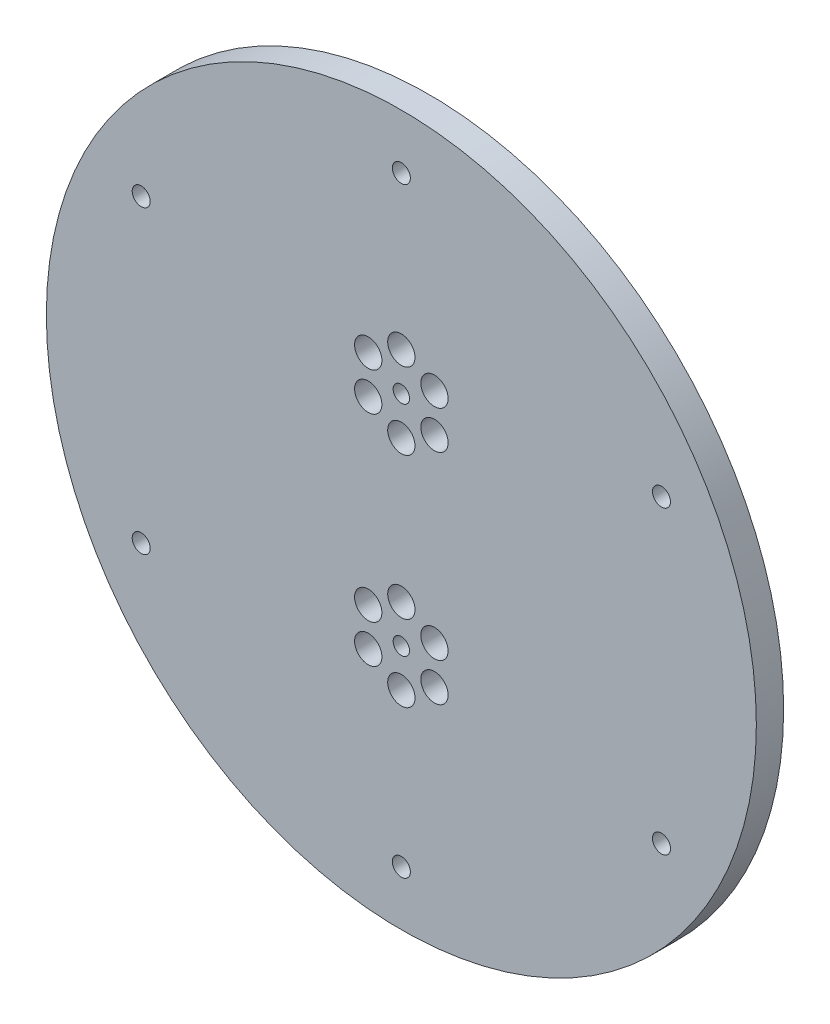
ISO-10303-21;
HEADER;
FILE_DESCRIPTION(('STEP AP214'),'2;1');
FILE_NAME('part.step','',(''),(''),'','','');
FILE_SCHEMA(('AUTOMOTIVE_DESIGN { 1 0 10303 214 1 1 1 1 }'));
ENDSEC;
DATA;
#1=APPLICATION_CONTEXT('core data for automotive mechanical design processes');
#2=APPLICATION_PROTOCOL_DEFINITION('international standard','automotive_design',2000,#1);
#3=PRODUCT_CONTEXT('',#1,'mechanical');
#4=PRODUCT('Part','Part','',(#3));
#5=PRODUCT_RELATED_PRODUCT_CATEGORY('part','',(#4));
#6=PRODUCT_DEFINITION_FORMATION('','',#4);
#7=PRODUCT_DEFINITION_CONTEXT('part definition',#1,'design');
#8=PRODUCT_DEFINITION('design','',#6,#7);
#9=PRODUCT_DEFINITION_SHAPE('','',#8);
#10=(LENGTH_UNIT() NAMED_UNIT(*) SI_UNIT(.MILLI.,.METRE.));
#11=(NAMED_UNIT(*) PLANE_ANGLE_UNIT() SI_UNIT($,.RADIAN.));
#12=(NAMED_UNIT(*) SI_UNIT($,.STERADIAN.) SOLID_ANGLE_UNIT());
#13=UNCERTAINTY_MEASURE_WITH_UNIT(LENGTH_MEASURE(1.E-05),#10,'distance_accuracy_value','');
#14=(GEOMETRIC_REPRESENTATION_CONTEXT(3) GLOBAL_UNCERTAINTY_ASSIGNED_CONTEXT((#13)) GLOBAL_UNIT_ASSIGNED_CONTEXT((#10,
#11,#12)) REPRESENTATION_CONTEXT('',''));
#15=CARTESIAN_POINT('',(0.,0.,0.));
#16=DIRECTION('',(0.,0.,1.));
#17=DIRECTION('',(1.,0.,0.));
#18=AXIS2_PLACEMENT_3D('',#15,#16,#17);
#19=CARTESIAN_POINT('',(0.,0.,5.));
#20=DIRECTION('',(0.,0.,1.));
#21=DIRECTION('',(1.,0.,0.));
#22=AXIS2_PLACEMENT_3D('',#19,#20,#21);
#23=PLANE('',#22);
#24=CARTESIAN_POINT('',(0.,-27.,5.));
#25=DIRECTION('',(0.,0.,1.));
#26=DIRECTION('',(-1.,0.,0.));
#27=AXIS2_PLACEMENT_3D('',#24,#25,#26);
#28=CIRCLE('',#27,2.5);
#29=CARTESIAN_POINT('',(-2.5,-27.,5.));
#30=VERTEX_POINT('',#29);
#31=EDGE_CURVE('E149',#30,#30,#28,.T.);
#32=ORIENTED_EDGE('',*,*,#31,.F.);
#33=EDGE_LOOP('',(#32));
#34=FACE_BOUND('',#33,.T.);
#35=CARTESIAN_POINT('',(0.,-20.,5.));
#36=DIRECTION('',(0.,0.,1.));
#37=DIRECTION('',(-1.,0.,0.));
#38=AXIS2_PLACEMENT_3D('',#35,#36,#37);
#39=CIRCLE('',#38,1.5);
#40=CARTESIAN_POINT('',(-1.5,-20.,5.));
#41=VERTEX_POINT('',#40);
#42=EDGE_CURVE('E137',#41,#41,#39,.T.);
#43=ORIENTED_EDGE('',*,*,#42,.F.);
#44=EDGE_LOOP('',(#43));
#45=FACE_BOUND('',#44,.T.);
#46=CARTESIAN_POINT('',(0.,-13.,5.));
#47=DIRECTION('',(0.,0.,1.));
#48=DIRECTION('',(-1.,0.,0.));
#49=AXIS2_PLACEMENT_3D('',#46,#47,#48);
#50=CIRCLE('',#49,2.5);
#51=CARTESIAN_POINT('',(-2.5,-13.,5.));
#52=VERTEX_POINT('',#51);
#53=EDGE_CURVE('E125',#52,#52,#50,.T.);
#54=ORIENTED_EDGE('',*,*,#53,.F.);
#55=EDGE_LOOP('',(#54));
#56=FACE_BOUND('',#55,.T.);
#57=CARTESIAN_POINT('',(-6.06217782649107,23.5,5.));
#58=DIRECTION('',(0.,0.,1.));
#59=DIRECTION('',(1.,0.,0.));
#60=AXIS2_PLACEMENT_3D('',#57,#58,#59);
#61=CIRCLE('',#60,2.5);
#62=CARTESIAN_POINT('',(-3.56217782649107,23.5,5.));
#63=VERTEX_POINT('',#62);
#64=EDGE_CURVE('E113',#63,#63,#61,.T.);
#65=ORIENTED_EDGE('',*,*,#64,.F.);
#66=EDGE_LOOP('',(#65));
#67=FACE_BOUND('',#66,.T.);
#68=CARTESIAN_POINT('',(0.,13.,5.));
#69=DIRECTION('',(0.,0.,1.));
#70=DIRECTION('',(1.,0.,0.));
#71=AXIS2_PLACEMENT_3D('',#68,#69,#70);
#72=CIRCLE('',#71,2.5);
#73=CARTESIAN_POINT('',(2.5,13.,5.));
#74=VERTEX_POINT('',#73);
#75=EDGE_CURVE('E101',#74,#74,#72,.T.);
#76=ORIENTED_EDGE('',*,*,#75,.F.);
#77=EDGE_LOOP('',(#76));
#78=FACE_BOUND('',#77,.T.);
#79=CARTESIAN_POINT('',(6.06217782649107,23.5,5.));
#80=DIRECTION('',(0.,0.,1.));
#81=DIRECTION('',(1.,0.,0.));
#82=AXIS2_PLACEMENT_3D('',#79,#80,#81);
#83=CIRCLE('',#82,2.5);
#84=CARTESIAN_POINT('',(8.56217782649107,23.5,5.));
#85=VERTEX_POINT('',#84);
#86=EDGE_CURVE('E89',#85,#85,#83,.T.);
#87=ORIENTED_EDGE('',*,*,#86,.F.);
#88=EDGE_LOOP('',(#87));
#89=FACE_BOUND('',#88,.T.);
#90=CARTESIAN_POINT('',(0.,27.,5.));
#91=DIRECTION('',(0.,0.,1.));
#92=DIRECTION('',(1.,0.,0.));
#93=AXIS2_PLACEMENT_3D('',#90,#91,#92);
#94=CIRCLE('',#93,2.5);
#95=CARTESIAN_POINT('',(2.50000000000001,27.,5.));
#96=VERTEX_POINT('',#95);
#97=EDGE_CURVE('E77',#96,#96,#94,.T.);
#98=ORIENTED_EDGE('',*,*,#97,.F.);
#99=EDGE_LOOP('',(#98));
#100=FACE_BOUND('',#99,.T.);
#101=CARTESIAN_POINT('',(-47.6313972081441,-27.5,5.));
#102=DIRECTION('',(0.,0.,1.));
#103=DIRECTION('',(1.,0.,0.));
#104=AXIS2_PLACEMENT_3D('',#101,#102,#103);
#105=CIRCLE('',#104,1.65);
#106=CARTESIAN_POINT('',(-45.9813972081441,-27.5,5.));
#107=VERTEX_POINT('',#106);
#108=EDGE_CURVE('E65',#107,#107,#105,.T.);
#109=ORIENTED_EDGE('',*,*,#108,.F.);
#110=EDGE_LOOP('',(#109));
#111=FACE_BOUND('',#110,.T.);
#112=CARTESIAN_POINT('',(47.6313972081441,-27.5,5.));
#113=DIRECTION('',(0.,0.,1.));
#114=DIRECTION('',(1.,0.,0.));
#115=AXIS2_PLACEMENT_3D('',#112,#113,#114);
#116=CIRCLE('',#115,1.65000000000015);
#117=CARTESIAN_POINT('',(49.2813972081443,-27.5,5.));
#118=VERTEX_POINT('',#117);
#119=EDGE_CURVE('E53',#118,#118,#116,.T.);
#120=ORIENTED_EDGE('',*,*,#119,.F.);
#121=EDGE_LOOP('',(#120));
#122=FACE_BOUND('',#121,.T.);
#123=CARTESIAN_POINT('',(0.,55.,5.));
#124=DIRECTION('',(0.,0.,1.));
#125=DIRECTION('',(1.,0.,0.));
#126=AXIS2_PLACEMENT_3D('',#123,#124,#125);
#127=CIRCLE('',#126,1.65);
#128=CARTESIAN_POINT('',(1.65,55.,5.));
#129=VERTEX_POINT('',#128);
#130=EDGE_CURVE('E42',#129,#129,#127,.T.);
#131=ORIENTED_EDGE('',*,*,#130,.F.);
#132=EDGE_LOOP('',(#131));
#133=FACE_BOUND('',#132,.T.);
#134=CARTESIAN_POINT('',(0.,0.,5.));
#135=DIRECTION('',(0.,0.,1.));
#136=DIRECTION('',(1.,0.,0.));
#137=AXIS2_PLACEMENT_3D('',#134,#135,#136);
#138=CIRCLE('',#137,65.);
#139=CARTESIAN_POINT('',(65.,0.,5.));
#140=VERTEX_POINT('',#139);
#141=EDGE_CURVE('E10',#140,#140,#138,.T.);
#142=ORIENTED_EDGE('',*,*,#141,.T.);
#143=EDGE_LOOP('',(#142));
#144=FACE_BOUND('',#143,.T.);
#145=CARTESIAN_POINT('',(47.6313972081441,27.5,5.));
#146=DIRECTION('',(0.,0.,1.));
#147=DIRECTION('',(1.,0.,0.));
#148=AXIS2_PLACEMENT_3D('',#145,#146,#147);
#149=CIRCLE('',#148,1.65000000000008);
#150=CARTESIAN_POINT('',(49.2813972081442,27.5,5.));
#151=VERTEX_POINT('',#150);
#152=EDGE_CURVE('E47',#151,#151,#149,.T.);
#153=ORIENTED_EDGE('',*,*,#152,.F.);
#154=EDGE_LOOP('',(#153));
#155=FACE_BOUND('',#154,.T.);
#156=CARTESIAN_POINT('',(0.,-55.,5.));
#157=DIRECTION('',(0.,0.,1.));
#158=DIRECTION('',(1.,0.,0.));
#159=AXIS2_PLACEMENT_3D('',#156,#157,#158);
#160=CIRCLE('',#159,1.65);
#161=CARTESIAN_POINT('',(1.65000000000001,-55.,5.));
#162=VERTEX_POINT('',#161);
#163=EDGE_CURVE('E59',#162,#162,#160,.T.);
#164=ORIENTED_EDGE('',*,*,#163,.F.);
#165=EDGE_LOOP('',(#164));
#166=FACE_BOUND('',#165,.T.);
#167=CARTESIAN_POINT('',(-47.6313972081442,27.5,5.));
#168=DIRECTION('',(0.,0.,1.));
#169=DIRECTION('',(1.,0.,0.));
#170=AXIS2_PLACEMENT_3D('',#167,#168,#169);
#171=CIRCLE('',#170,1.65);
#172=CARTESIAN_POINT('',(-45.9813972081442,27.5,5.));
#173=VERTEX_POINT('',#172);
#174=EDGE_CURVE('E71',#173,#173,#171,.T.);
#175=ORIENTED_EDGE('',*,*,#174,.F.);
#176=EDGE_LOOP('',(#175));
#177=FACE_BOUND('',#176,.T.);
#178=CARTESIAN_POINT('',(0.,20.,5.));
#179=DIRECTION('',(0.,0.,1.));
#180=DIRECTION('',(1.,0.,0.));
#181=AXIS2_PLACEMENT_3D('',#178,#179,#180);
#182=CIRCLE('',#181,1.5);
#183=CARTESIAN_POINT('',(1.5,20.,5.));
#184=VERTEX_POINT('',#183);
#185=EDGE_CURVE('E83',#184,#184,#182,.T.);
#186=ORIENTED_EDGE('',*,*,#185,.F.);
#187=EDGE_LOOP('',(#186));
#188=FACE_BOUND('',#187,.T.);
#189=CARTESIAN_POINT('',(6.06217782649107,16.5,5.));
#190=DIRECTION('',(0.,0.,1.));
#191=DIRECTION('',(1.,0.,0.));
#192=AXIS2_PLACEMENT_3D('',#189,#190,#191);
#193=CIRCLE('',#192,2.5);
#194=CARTESIAN_POINT('',(8.56217782649107,16.5,5.));
#195=VERTEX_POINT('',#194);
#196=EDGE_CURVE('E95',#195,#195,#193,.T.);
#197=ORIENTED_EDGE('',*,*,#196,.F.);
#198=EDGE_LOOP('',(#197));
#199=FACE_BOUND('',#198,.T.);
#200=CARTESIAN_POINT('',(-6.06217782649107,16.5,5.));
#201=DIRECTION('',(0.,0.,1.));
#202=DIRECTION('',(1.,0.,0.));
#203=AXIS2_PLACEMENT_3D('',#200,#201,#202);
#204=CIRCLE('',#203,2.5);
#205=CARTESIAN_POINT('',(-3.56217782649107,16.5,5.));
#206=VERTEX_POINT('',#205);
#207=EDGE_CURVE('E107',#206,#206,#204,.T.);
#208=ORIENTED_EDGE('',*,*,#207,.F.);
#209=EDGE_LOOP('',(#208));
#210=FACE_BOUND('',#209,.T.);
#211=CARTESIAN_POINT('',(6.06217782649107,-16.5,5.));
#212=DIRECTION('',(0.,0.,1.));
#213=DIRECTION('',(-1.,0.,0.));
#214=AXIS2_PLACEMENT_3D('',#211,#212,#213);
#215=CIRCLE('',#214,2.5);
#216=CARTESIAN_POINT('',(3.56217782649107,-16.5,5.));
#217=VERTEX_POINT('',#216);
#218=EDGE_CURVE('E119',#217,#217,#215,.T.);
#219=ORIENTED_EDGE('',*,*,#218,.F.);
#220=EDGE_LOOP('',(#219));
#221=FACE_BOUND('',#220,.T.);
#222=CARTESIAN_POINT('',(-6.06217782649107,-16.5,5.));
#223=DIRECTION('',(0.,0.,1.));
#224=DIRECTION('',(-1.,0.,0.));
#225=AXIS2_PLACEMENT_3D('',#222,#223,#224);
#226=CIRCLE('',#225,2.5);
#227=CARTESIAN_POINT('',(-8.56217782649107,-16.5,5.));
#228=VERTEX_POINT('',#227);
#229=EDGE_CURVE('E131',#228,#228,#226,.T.);
#230=ORIENTED_EDGE('',*,*,#229,.F.);
#231=EDGE_LOOP('',(#230));
#232=FACE_BOUND('',#231,.T.);
#233=CARTESIAN_POINT('',(-6.06217782649107,-23.5,5.));
#234=DIRECTION('',(0.,0.,1.));
#235=DIRECTION('',(-1.,0.,0.));
#236=AXIS2_PLACEMENT_3D('',#233,#234,#235);
#237=CIRCLE('',#236,2.5);
#238=CARTESIAN_POINT('',(-8.56217782649107,-23.5,5.));
#239=VERTEX_POINT('',#238);
#240=EDGE_CURVE('E143',#239,#239,#237,.T.);
#241=ORIENTED_EDGE('',*,*,#240,.F.);
#242=EDGE_LOOP('',(#241));
#243=FACE_BOUND('',#242,.T.);
#244=CARTESIAN_POINT('',(6.06217782649107,-23.5,5.));
#245=DIRECTION('',(0.,0.,1.));
#246=DIRECTION('',(-1.,0.,0.));
#247=AXIS2_PLACEMENT_3D('',#244,#245,#246);
#248=CIRCLE('',#247,2.5);
#249=CARTESIAN_POINT('',(3.56217782649107,-23.5,5.));
#250=VERTEX_POINT('',#249);
#251=EDGE_CURVE('E155',#250,#250,#248,.T.);
#252=ORIENTED_EDGE('',*,*,#251,.F.);
#253=EDGE_LOOP('',(#252));
#254=FACE_BOUND('',#253,.T.);
#255=ADVANCED_FACE('F31',(#34,#45,#56,#67,#78,#89,#100,#111,#122,#133,#144,#155,#166,#177,#188,
#199,#210,#221,#232,#243,#254),#23,.T.);
#256=CARTESIAN_POINT('',(0.,0.,0.));
#257=DIRECTION('',(0.,0.,1.));
#258=DIRECTION('',(1.,0.,0.));
#259=AXIS2_PLACEMENT_3D('',#256,#257,#258);
#260=PLANE('',#259);
#261=CARTESIAN_POINT('',(0.,0.,0.));
#262=DIRECTION('',(0.,0.,1.));
#263=DIRECTION('',(1.,0.,0.));
#264=AXIS2_PLACEMENT_3D('',#261,#262,#263);
#265=CIRCLE('',#264,65.);
#266=CARTESIAN_POINT('',(65.,0.,0.));
#267=VERTEX_POINT('',#266);
#268=EDGE_CURVE('E35',#267,#267,#265,.T.);
#269=ORIENTED_EDGE('',*,*,#268,.F.);
#270=EDGE_LOOP('',(#269));
#271=FACE_BOUND('',#270,.T.);
#272=CARTESIAN_POINT('',(0.,55.,0.));
#273=DIRECTION('',(0.,0.,1.));
#274=DIRECTION('',(1.,0.,0.));
#275=AXIS2_PLACEMENT_3D('',#272,#273,#274);
#276=CIRCLE('',#275,1.65);
#277=CARTESIAN_POINT('',(1.65,55.,0.));
#278=VERTEX_POINT('',#277);
#279=EDGE_CURVE('E44',#278,#278,#276,.T.);
#280=ORIENTED_EDGE('',*,*,#279,.T.);
#281=EDGE_LOOP('',(#280));
#282=FACE_BOUND('',#281,.T.);
#283=CARTESIAN_POINT('',(47.6313972081441,27.5,0.));
#284=DIRECTION('',(0.,0.,1.));
#285=DIRECTION('',(1.,0.,0.));
#286=AXIS2_PLACEMENT_3D('',#283,#284,#285);
#287=CIRCLE('',#286,1.65000000000008);
#288=CARTESIAN_POINT('',(49.2813972081442,27.5,0.));
#289=VERTEX_POINT('',#288);
#290=EDGE_CURVE('E50',#289,#289,#287,.T.);
#291=ORIENTED_EDGE('',*,*,#290,.T.);
#292=EDGE_LOOP('',(#291));
#293=FACE_BOUND('',#292,.T.);
#294=CARTESIAN_POINT('',(47.6313972081441,-27.5,0.));
#295=DIRECTION('',(0.,0.,1.));
#296=DIRECTION('',(1.,0.,0.));
#297=AXIS2_PLACEMENT_3D('',#294,#295,#296);
#298=CIRCLE('',#297,1.65000000000015);
#299=CARTESIAN_POINT('',(49.2813972081443,-27.5,0.));
#300=VERTEX_POINT('',#299);
#301=EDGE_CURVE('E56',#300,#300,#298,.T.);
#302=ORIENTED_EDGE('',*,*,#301,.T.);
#303=EDGE_LOOP('',(#302));
#304=FACE_BOUND('',#303,.T.);
#305=CARTESIAN_POINT('',(0.,-55.,0.));
#306=DIRECTION('',(0.,0.,1.));
#307=DIRECTION('',(1.,0.,0.));
#308=AXIS2_PLACEMENT_3D('',#305,#306,#307);
#309=CIRCLE('',#308,1.65);
#310=CARTESIAN_POINT('',(1.65000000000001,-55.,0.));
#311=VERTEX_POINT('',#310);
#312=EDGE_CURVE('E62',#311,#311,#309,.T.);
#313=ORIENTED_EDGE('',*,*,#312,.T.);
#314=EDGE_LOOP('',(#313));
#315=FACE_BOUND('',#314,.T.);
#316=CARTESIAN_POINT('',(-47.6313972081441,-27.5,0.));
#317=DIRECTION('',(0.,0.,1.));
#318=DIRECTION('',(1.,0.,0.));
#319=AXIS2_PLACEMENT_3D('',#316,#317,#318);
#320=CIRCLE('',#319,1.65);
#321=CARTESIAN_POINT('',(-45.9813972081441,-27.5,0.));
#322=VERTEX_POINT('',#321);
#323=EDGE_CURVE('E68',#322,#322,#320,.T.);
#324=ORIENTED_EDGE('',*,*,#323,.T.);
#325=EDGE_LOOP('',(#324));
#326=FACE_BOUND('',#325,.T.);
#327=CARTESIAN_POINT('',(-47.6313972081442,27.5,0.));
#328=DIRECTION('',(0.,0.,1.));
#329=DIRECTION('',(1.,0.,0.));
#330=AXIS2_PLACEMENT_3D('',#327,#328,#329);
#331=CIRCLE('',#330,1.65);
#332=CARTESIAN_POINT('',(-45.9813972081442,27.5,0.));
#333=VERTEX_POINT('',#332);
#334=EDGE_CURVE('E74',#333,#333,#331,.T.);
#335=ORIENTED_EDGE('',*,*,#334,.T.);
#336=EDGE_LOOP('',(#335));
#337=FACE_BOUND('',#336,.T.);
#338=CARTESIAN_POINT('',(0.,27.,0.));
#339=DIRECTION('',(0.,0.,1.));
#340=DIRECTION('',(1.,0.,0.));
#341=AXIS2_PLACEMENT_3D('',#338,#339,#340);
#342=CIRCLE('',#341,2.5);
#343=CARTESIAN_POINT('',(2.50000000000001,27.,0.));
#344=VERTEX_POINT('',#343);
#345=EDGE_CURVE('E80',#344,#344,#342,.T.);
#346=ORIENTED_EDGE('',*,*,#345,.T.);
#347=EDGE_LOOP('',(#346));
#348=FACE_BOUND('',#347,.T.);
#349=CARTESIAN_POINT('',(0.,20.,0.));
#350=DIRECTION('',(0.,0.,1.));
#351=DIRECTION('',(1.,0.,0.));
#352=AXIS2_PLACEMENT_3D('',#349,#350,#351);
#353=CIRCLE('',#352,1.5);
#354=CARTESIAN_POINT('',(1.5,20.,0.));
#355=VERTEX_POINT('',#354);
#356=EDGE_CURVE('E86',#355,#355,#353,.T.);
#357=ORIENTED_EDGE('',*,*,#356,.T.);
#358=EDGE_LOOP('',(#357));
#359=FACE_BOUND('',#358,.T.);
#360=CARTESIAN_POINT('',(6.06217782649107,23.5,0.));
#361=DIRECTION('',(0.,0.,1.));
#362=DIRECTION('',(1.,0.,0.));
#363=AXIS2_PLACEMENT_3D('',#360,#361,#362);
#364=CIRCLE('',#363,2.5);
#365=CARTESIAN_POINT('',(8.56217782649107,23.5,0.));
#366=VERTEX_POINT('',#365);
#367=EDGE_CURVE('E92',#366,#366,#364,.T.);
#368=ORIENTED_EDGE('',*,*,#367,.T.);
#369=EDGE_LOOP('',(#368));
#370=FACE_BOUND('',#369,.T.);
#371=CARTESIAN_POINT('',(6.06217782649107,16.5,0.));
#372=DIRECTION('',(0.,0.,1.));
#373=DIRECTION('',(1.,0.,0.));
#374=AXIS2_PLACEMENT_3D('',#371,#372,#373);
#375=CIRCLE('',#374,2.5);
#376=CARTESIAN_POINT('',(8.56217782649107,16.5,0.));
#377=VERTEX_POINT('',#376);
#378=EDGE_CURVE('E98',#377,#377,#375,.T.);
#379=ORIENTED_EDGE('',*,*,#378,.T.);
#380=EDGE_LOOP('',(#379));
#381=FACE_BOUND('',#380,.T.);
#382=CARTESIAN_POINT('',(0.,13.,0.));
#383=DIRECTION('',(0.,0.,1.));
#384=DIRECTION('',(1.,0.,0.));
#385=AXIS2_PLACEMENT_3D('',#382,#383,#384);
#386=CIRCLE('',#385,2.5);
#387=CARTESIAN_POINT('',(2.5,13.,0.));
#388=VERTEX_POINT('',#387);
#389=EDGE_CURVE('E104',#388,#388,#386,.T.);
#390=ORIENTED_EDGE('',*,*,#389,.T.);
#391=EDGE_LOOP('',(#390));
#392=FACE_BOUND('',#391,.T.);
#393=CARTESIAN_POINT('',(-6.06217782649107,16.5,0.));
#394=DIRECTION('',(0.,0.,1.));
#395=DIRECTION('',(1.,0.,0.));
#396=AXIS2_PLACEMENT_3D('',#393,#394,#395);
#397=CIRCLE('',#396,2.5);
#398=CARTESIAN_POINT('',(-3.56217782649107,16.5,0.));
#399=VERTEX_POINT('',#398);
#400=EDGE_CURVE('E110',#399,#399,#397,.T.);
#401=ORIENTED_EDGE('',*,*,#400,.T.);
#402=EDGE_LOOP('',(#401));
#403=FACE_BOUND('',#402,.T.);
#404=CARTESIAN_POINT('',(-6.06217782649107,23.5,0.));
#405=DIRECTION('',(0.,0.,1.));
#406=DIRECTION('',(1.,0.,0.));
#407=AXIS2_PLACEMENT_3D('',#404,#405,#406);
#408=CIRCLE('',#407,2.5);
#409=CARTESIAN_POINT('',(-3.56217782649107,23.5,0.));
#410=VERTEX_POINT('',#409);
#411=EDGE_CURVE('E116',#410,#410,#408,.T.);
#412=ORIENTED_EDGE('',*,*,#411,.T.);
#413=EDGE_LOOP('',(#412));
#414=FACE_BOUND('',#413,.T.);
#415=CARTESIAN_POINT('',(6.06217782649107,-16.5,0.));
#416=DIRECTION('',(0.,0.,1.));
#417=DIRECTION('',(-1.,0.,0.));
#418=AXIS2_PLACEMENT_3D('',#415,#416,#417);
#419=CIRCLE('',#418,2.5);
#420=CARTESIAN_POINT('',(3.56217782649107,-16.5,0.));
#421=VERTEX_POINT('',#420);
#422=EDGE_CURVE('E122',#421,#421,#419,.T.);
#423=ORIENTED_EDGE('',*,*,#422,.T.);
#424=EDGE_LOOP('',(#423));
#425=FACE_BOUND('',#424,.T.);
#426=CARTESIAN_POINT('',(0.,-13.,0.));
#427=DIRECTION('',(0.,0.,1.));
#428=DIRECTION('',(-1.,0.,0.));
#429=AXIS2_PLACEMENT_3D('',#426,#427,#428);
#430=CIRCLE('',#429,2.5);
#431=CARTESIAN_POINT('',(-2.5,-13.,0.));
#432=VERTEX_POINT('',#431);
#433=EDGE_CURVE('E128',#432,#432,#430,.T.);
#434=ORIENTED_EDGE('',*,*,#433,.T.);
#435=EDGE_LOOP('',(#434));
#436=FACE_BOUND('',#435,.T.);
#437=CARTESIAN_POINT('',(-6.06217782649107,-16.5,0.));
#438=DIRECTION('',(0.,0.,1.));
#439=DIRECTION('',(-1.,0.,0.));
#440=AXIS2_PLACEMENT_3D('',#437,#438,#439);
#441=CIRCLE('',#440,2.5);
#442=CARTESIAN_POINT('',(-8.56217782649107,-16.5,0.));
#443=VERTEX_POINT('',#442);
#444=EDGE_CURVE('E134',#443,#443,#441,.T.);
#445=ORIENTED_EDGE('',*,*,#444,.T.);
#446=EDGE_LOOP('',(#445));
#447=FACE_BOUND('',#446,.T.);
#448=CARTESIAN_POINT('',(0.,-20.,0.));
#449=DIRECTION('',(0.,0.,1.));
#450=DIRECTION('',(-1.,0.,0.));
#451=AXIS2_PLACEMENT_3D('',#448,#449,#450);
#452=CIRCLE('',#451,1.5);
#453=CARTESIAN_POINT('',(-1.5,-20.,0.));
#454=VERTEX_POINT('',#453);
#455=EDGE_CURVE('E140',#454,#454,#452,.T.);
#456=ORIENTED_EDGE('',*,*,#455,.T.);
#457=EDGE_LOOP('',(#456));
#458=FACE_BOUND('',#457,.T.);
#459=CARTESIAN_POINT('',(-6.06217782649107,-23.5,0.));
#460=DIRECTION('',(0.,0.,1.));
#461=DIRECTION('',(-1.,0.,0.));
#462=AXIS2_PLACEMENT_3D('',#459,#460,#461);
#463=CIRCLE('',#462,2.5);
#464=CARTESIAN_POINT('',(-8.56217782649107,-23.5,0.));
#465=VERTEX_POINT('',#464);
#466=EDGE_CURVE('E146',#465,#465,#463,.T.);
#467=ORIENTED_EDGE('',*,*,#466,.T.);
#468=EDGE_LOOP('',(#467));
#469=FACE_BOUND('',#468,.T.);
#470=CARTESIAN_POINT('',(0.,-27.,0.));
#471=DIRECTION('',(0.,0.,1.));
#472=DIRECTION('',(-1.,0.,0.));
#473=AXIS2_PLACEMENT_3D('',#470,#471,#472);
#474=CIRCLE('',#473,2.5);
#475=CARTESIAN_POINT('',(-2.5,-27.,0.));
#476=VERTEX_POINT('',#475);
#477=EDGE_CURVE('E152',#476,#476,#474,.T.);
#478=ORIENTED_EDGE('',*,*,#477,.T.);
#479=EDGE_LOOP('',(#478));
#480=FACE_BOUND('',#479,.T.);
#481=CARTESIAN_POINT('',(6.06217782649107,-23.5,0.));
#482=DIRECTION('',(0.,0.,1.));
#483=DIRECTION('',(-1.,0.,0.));
#484=AXIS2_PLACEMENT_3D('',#481,#482,#483);
#485=CIRCLE('',#484,2.5);
#486=CARTESIAN_POINT('',(3.56217782649107,-23.5,0.));
#487=VERTEX_POINT('',#486);
#488=EDGE_CURVE('E158',#487,#487,#485,.T.);
#489=ORIENTED_EDGE('',*,*,#488,.T.);
#490=EDGE_LOOP('',(#489));
#491=FACE_BOUND('',#490,.T.);
#492=ADVANCED_FACE('F168',(#271,#282,#293,#304,#315,#326,#337,#348,#359,#370,#381,#392,#403,
#414,#425,#436,#447,#458,#469,#480,#491),#260,.F.);
#493=CARTESIAN_POINT('',(0.,0.,5.));
#494=DIRECTION('',(0.,0.,-1.));
#495=DIRECTION('',(-1.,0.,0.));
#496=AXIS2_PLACEMENT_3D('',#493,#494,#495);
#497=CYLINDRICAL_SURFACE('',#496,65.);
#498=ORIENTED_EDGE('',*,*,#141,.F.);
#499=EDGE_LOOP('',(#498));
#500=FACE_BOUND('',#499,.T.);
#501=ORIENTED_EDGE('',*,*,#268,.T.);
#502=EDGE_LOOP('',(#501));
#503=FACE_BOUND('',#502,.T.);
#504=ADVANCED_FACE('F33',(#500,#503),#497,.T.);
#505=CARTESIAN_POINT('',(0.,55.,5.));
#506=DIRECTION('',(0.,0.,-1.));
#507=DIRECTION('',(-1.,0.,0.));
#508=AXIS2_PLACEMENT_3D('',#505,#506,#507);
#509=CYLINDRICAL_SURFACE('',#508,1.65);
#510=ORIENTED_EDGE('',*,*,#130,.T.);
#511=EDGE_LOOP('',(#510));
#512=FACE_BOUND('',#511,.T.);
#513=ORIENTED_EDGE('',*,*,#279,.F.);
#514=EDGE_LOOP('',(#513));
#515=FACE_BOUND('',#514,.T.);
#516=ADVANCED_FACE('F178',(#512,#515),#509,.F.);
#517=CARTESIAN_POINT('',(47.6313972081441,27.5,5.));
#518=DIRECTION('',(0.,0.,-1.));
#519=DIRECTION('',(-1.,0.,0.));
#520=AXIS2_PLACEMENT_3D('',#517,#518,#519);
#521=CYLINDRICAL_SURFACE('',#520,1.65000000000008);
#522=ORIENTED_EDGE('',*,*,#152,.T.);
#523=EDGE_LOOP('',(#522));
#524=FACE_BOUND('',#523,.T.);
#525=ORIENTED_EDGE('',*,*,#290,.F.);
#526=EDGE_LOOP('',(#525));
#527=FACE_BOUND('',#526,.T.);
#528=ADVANCED_FACE('F181',(#524,#527),#521,.F.);
#529=CARTESIAN_POINT('',(47.6313972081441,-27.5,5.));
#530=DIRECTION('',(0.,0.,-1.));
#531=DIRECTION('',(-1.,0.,0.));
#532=AXIS2_PLACEMENT_3D('',#529,#530,#531);
#533=CYLINDRICAL_SURFACE('',#532,1.65000000000015);
#534=ORIENTED_EDGE('',*,*,#119,.T.);
#535=EDGE_LOOP('',(#534));
#536=FACE_BOUND('',#535,.T.);
#537=ORIENTED_EDGE('',*,*,#301,.F.);
#538=EDGE_LOOP('',(#537));
#539=FACE_BOUND('',#538,.T.);
#540=ADVANCED_FACE('F185',(#536,#539),#533,.F.);
#541=CARTESIAN_POINT('',(0.,-55.,5.));
#542=DIRECTION('',(0.,0.,-1.));
#543=DIRECTION('',(-1.,0.,0.));
#544=AXIS2_PLACEMENT_3D('',#541,#542,#543);
#545=CYLINDRICAL_SURFACE('',#544,1.65);
#546=ORIENTED_EDGE('',*,*,#163,.T.);
#547=EDGE_LOOP('',(#546));
#548=FACE_BOUND('',#547,.T.);
#549=ORIENTED_EDGE('',*,*,#312,.F.);
#550=EDGE_LOOP('',(#549));
#551=FACE_BOUND('',#550,.T.);
#552=ADVANCED_FACE('F189',(#548,#551),#545,.F.);
#553=CARTESIAN_POINT('',(-47.6313972081441,-27.5,5.));
#554=DIRECTION('',(0.,0.,-1.));
#555=DIRECTION('',(-1.,0.,0.));
#556=AXIS2_PLACEMENT_3D('',#553,#554,#555);
#557=CYLINDRICAL_SURFACE('',#556,1.65);
#558=ORIENTED_EDGE('',*,*,#108,.T.);
#559=EDGE_LOOP('',(#558));
#560=FACE_BOUND('',#559,.T.);
#561=ORIENTED_EDGE('',*,*,#323,.F.);
#562=EDGE_LOOP('',(#561));
#563=FACE_BOUND('',#562,.T.);
#564=ADVANCED_FACE('F193',(#560,#563),#557,.F.);
#565=CARTESIAN_POINT('',(-47.6313972081442,27.5,5.));
#566=DIRECTION('',(0.,0.,-1.));
#567=DIRECTION('',(-1.,0.,0.));
#568=AXIS2_PLACEMENT_3D('',#565,#566,#567);
#569=CYLINDRICAL_SURFACE('',#568,1.65);
#570=ORIENTED_EDGE('',*,*,#174,.T.);
#571=EDGE_LOOP('',(#570));
#572=FACE_BOUND('',#571,.T.);
#573=ORIENTED_EDGE('',*,*,#334,.F.);
#574=EDGE_LOOP('',(#573));
#575=FACE_BOUND('',#574,.T.);
#576=ADVANCED_FACE('F197',(#572,#575),#569,.F.);
#577=CARTESIAN_POINT('',(0.,27.,5.));
#578=DIRECTION('',(0.,0.,-1.));
#579=DIRECTION('',(-1.,0.,0.));
#580=AXIS2_PLACEMENT_3D('',#577,#578,#579);
#581=CYLINDRICAL_SURFACE('',#580,2.5);
#582=ORIENTED_EDGE('',*,*,#97,.T.);
#583=EDGE_LOOP('',(#582));
#584=FACE_BOUND('',#583,.T.);
#585=ORIENTED_EDGE('',*,*,#345,.F.);
#586=EDGE_LOOP('',(#585));
#587=FACE_BOUND('',#586,.T.);
#588=ADVANCED_FACE('F201',(#584,#587),#581,.F.);
#589=CARTESIAN_POINT('',(0.,20.,5.));
#590=DIRECTION('',(0.,0.,-1.));
#591=DIRECTION('',(-1.,0.,0.));
#592=AXIS2_PLACEMENT_3D('',#589,#590,#591);
#593=CYLINDRICAL_SURFACE('',#592,1.5);
#594=ORIENTED_EDGE('',*,*,#185,.T.);
#595=EDGE_LOOP('',(#594));
#596=FACE_BOUND('',#595,.T.);
#597=ORIENTED_EDGE('',*,*,#356,.F.);
#598=EDGE_LOOP('',(#597));
#599=FACE_BOUND('',#598,.T.);
#600=ADVANCED_FACE('F205',(#596,#599),#593,.F.);
#601=CARTESIAN_POINT('',(6.06217782649107,23.5,5.));
#602=DIRECTION('',(0.,0.,-1.));
#603=DIRECTION('',(-1.,0.,0.));
#604=AXIS2_PLACEMENT_3D('',#601,#602,#603);
#605=CYLINDRICAL_SURFACE('',#604,2.5);
#606=ORIENTED_EDGE('',*,*,#86,.T.);
#607=EDGE_LOOP('',(#606));
#608=FACE_BOUND('',#607,.T.);
#609=ORIENTED_EDGE('',*,*,#367,.F.);
#610=EDGE_LOOP('',(#609));
#611=FACE_BOUND('',#610,.T.);
#612=ADVANCED_FACE('F209',(#608,#611),#605,.F.);
#613=CARTESIAN_POINT('',(6.06217782649107,16.5,5.));
#614=DIRECTION('',(0.,0.,-1.));
#615=DIRECTION('',(-1.,0.,0.));
#616=AXIS2_PLACEMENT_3D('',#613,#614,#615);
#617=CYLINDRICAL_SURFACE('',#616,2.5);
#618=ORIENTED_EDGE('',*,*,#196,.T.);
#619=EDGE_LOOP('',(#618));
#620=FACE_BOUND('',#619,.T.);
#621=ORIENTED_EDGE('',*,*,#378,.F.);
#622=EDGE_LOOP('',(#621));
#623=FACE_BOUND('',#622,.T.);
#624=ADVANCED_FACE('F213',(#620,#623),#617,.F.);
#625=CARTESIAN_POINT('',(0.,13.,5.));
#626=DIRECTION('',(0.,0.,-1.));
#627=DIRECTION('',(-1.,0.,0.));
#628=AXIS2_PLACEMENT_3D('',#625,#626,#627);
#629=CYLINDRICAL_SURFACE('',#628,2.5);
#630=ORIENTED_EDGE('',*,*,#75,.T.);
#631=EDGE_LOOP('',(#630));
#632=FACE_BOUND('',#631,.T.);
#633=ORIENTED_EDGE('',*,*,#389,.F.);
#634=EDGE_LOOP('',(#633));
#635=FACE_BOUND('',#634,.T.);
#636=ADVANCED_FACE('F217',(#632,#635),#629,.F.);
#637=CARTESIAN_POINT('',(-6.06217782649107,16.5,5.));
#638=DIRECTION('',(0.,0.,-1.));
#639=DIRECTION('',(-1.,0.,0.));
#640=AXIS2_PLACEMENT_3D('',#637,#638,#639);
#641=CYLINDRICAL_SURFACE('',#640,2.5);
#642=ORIENTED_EDGE('',*,*,#207,.T.);
#643=EDGE_LOOP('',(#642));
#644=FACE_BOUND('',#643,.T.);
#645=ORIENTED_EDGE('',*,*,#400,.F.);
#646=EDGE_LOOP('',(#645));
#647=FACE_BOUND('',#646,.T.);
#648=ADVANCED_FACE('F221',(#644,#647),#641,.F.);
#649=CARTESIAN_POINT('',(-6.06217782649107,23.5,5.));
#650=DIRECTION('',(0.,0.,-1.));
#651=DIRECTION('',(-1.,0.,0.));
#652=AXIS2_PLACEMENT_3D('',#649,#650,#651);
#653=CYLINDRICAL_SURFACE('',#652,2.5);
#654=ORIENTED_EDGE('',*,*,#64,.T.);
#655=EDGE_LOOP('',(#654));
#656=FACE_BOUND('',#655,.T.);
#657=ORIENTED_EDGE('',*,*,#411,.F.);
#658=EDGE_LOOP('',(#657));
#659=FACE_BOUND('',#658,.T.);
#660=ADVANCED_FACE('F225',(#656,#659),#653,.F.);
#661=CARTESIAN_POINT('',(6.06217782649107,-16.5,5.));
#662=DIRECTION('',(0.,0.,-1.));
#663=DIRECTION('',(-1.,0.,0.));
#664=AXIS2_PLACEMENT_3D('',#661,#662,#663);
#665=CYLINDRICAL_SURFACE('',#664,2.5);
#666=ORIENTED_EDGE('',*,*,#218,.T.);
#667=EDGE_LOOP('',(#666));
#668=FACE_BOUND('',#667,.T.);
#669=ORIENTED_EDGE('',*,*,#422,.F.);
#670=EDGE_LOOP('',(#669));
#671=FACE_BOUND('',#670,.T.);
#672=ADVANCED_FACE('F229',(#668,#671),#665,.F.);
#673=CARTESIAN_POINT('',(0.,-13.,5.));
#674=DIRECTION('',(0.,0.,-1.));
#675=DIRECTION('',(-1.,0.,0.));
#676=AXIS2_PLACEMENT_3D('',#673,#674,#675);
#677=CYLINDRICAL_SURFACE('',#676,2.5);
#678=ORIENTED_EDGE('',*,*,#53,.T.);
#679=EDGE_LOOP('',(#678));
#680=FACE_BOUND('',#679,.T.);
#681=ORIENTED_EDGE('',*,*,#433,.F.);
#682=EDGE_LOOP('',(#681));
#683=FACE_BOUND('',#682,.T.);
#684=ADVANCED_FACE('F233',(#680,#683),#677,.F.);
#685=CARTESIAN_POINT('',(-6.06217782649107,-16.5,5.));
#686=DIRECTION('',(0.,0.,-1.));
#687=DIRECTION('',(-1.,0.,0.));
#688=AXIS2_PLACEMENT_3D('',#685,#686,#687);
#689=CYLINDRICAL_SURFACE('',#688,2.5);
#690=ORIENTED_EDGE('',*,*,#229,.T.);
#691=EDGE_LOOP('',(#690));
#692=FACE_BOUND('',#691,.T.);
#693=ORIENTED_EDGE('',*,*,#444,.F.);
#694=EDGE_LOOP('',(#693));
#695=FACE_BOUND('',#694,.T.);
#696=ADVANCED_FACE('F237',(#692,#695),#689,.F.);
#697=CARTESIAN_POINT('',(0.,-20.,5.));
#698=DIRECTION('',(0.,0.,-1.));
#699=DIRECTION('',(-1.,0.,0.));
#700=AXIS2_PLACEMENT_3D('',#697,#698,#699);
#701=CYLINDRICAL_SURFACE('',#700,1.5);
#702=ORIENTED_EDGE('',*,*,#42,.T.);
#703=EDGE_LOOP('',(#702));
#704=FACE_BOUND('',#703,.T.);
#705=ORIENTED_EDGE('',*,*,#455,.F.);
#706=EDGE_LOOP('',(#705));
#707=FACE_BOUND('',#706,.T.);
#708=ADVANCED_FACE('F241',(#704,#707),#701,.F.);
#709=CARTESIAN_POINT('',(-6.06217782649107,-23.5,5.));
#710=DIRECTION('',(0.,0.,-1.));
#711=DIRECTION('',(-1.,0.,0.));
#712=AXIS2_PLACEMENT_3D('',#709,#710,#711);
#713=CYLINDRICAL_SURFACE('',#712,2.5);
#714=ORIENTED_EDGE('',*,*,#240,.T.);
#715=EDGE_LOOP('',(#714));
#716=FACE_BOUND('',#715,.T.);
#717=ORIENTED_EDGE('',*,*,#466,.F.);
#718=EDGE_LOOP('',(#717));
#719=FACE_BOUND('',#718,.T.);
#720=ADVANCED_FACE('F245',(#716,#719),#713,.F.);
#721=CARTESIAN_POINT('',(0.,-27.,5.));
#722=DIRECTION('',(0.,0.,-1.));
#723=DIRECTION('',(-1.,0.,0.));
#724=AXIS2_PLACEMENT_3D('',#721,#722,#723);
#725=CYLINDRICAL_SURFACE('',#724,2.5);
#726=ORIENTED_EDGE('',*,*,#31,.T.);
#727=EDGE_LOOP('',(#726));
#728=FACE_BOUND('',#727,.T.);
#729=ORIENTED_EDGE('',*,*,#477,.F.);
#730=EDGE_LOOP('',(#729));
#731=FACE_BOUND('',#730,.T.);
#732=ADVANCED_FACE('F249',(#728,#731),#725,.F.);
#733=CARTESIAN_POINT('',(6.06217782649107,-23.5,5.));
#734=DIRECTION('',(0.,0.,-1.));
#735=DIRECTION('',(-1.,0.,0.));
#736=AXIS2_PLACEMENT_3D('',#733,#734,#735);
#737=CYLINDRICAL_SURFACE('',#736,2.5);
#738=ORIENTED_EDGE('',*,*,#251,.T.);
#739=EDGE_LOOP('',(#738));
#740=FACE_BOUND('',#739,.T.);
#741=ORIENTED_EDGE('',*,*,#488,.F.);
#742=EDGE_LOOP('',(#741));
#743=FACE_BOUND('',#742,.T.);
#744=ADVANCED_FACE('F164',(#740,#743),#737,.F.);
#745=CLOSED_SHELL('',(#255,#492,#504,#516,#528,#540,#552,#564,#576,#588,#600,#612,#624,#636,
#648,#660,#672,#684,#696,#708,#720,#732,#744));
#746=MANIFOLD_SOLID_BREP('B2',#745);
#747=ADVANCED_BREP_SHAPE_REPRESENTATION('',(#18,#746),#14);
#748=SHAPE_DEFINITION_REPRESENTATION(#9,#747);
ENDSEC;
END-ISO-10303-21;
